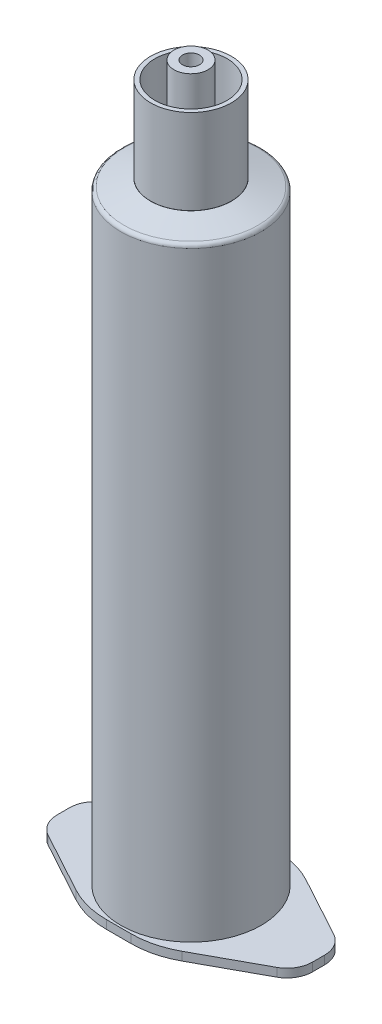
ISO-10303-21;
HEADER;
FILE_DESCRIPTION(('STEP AP214'),'2;1');
FILE_NAME('part.step','',(''),(''),'','','');
FILE_SCHEMA(('AUTOMOTIVE_DESIGN { 1 0 10303 214 1 1 1 1 }'));
ENDSEC;
DATA;
#1=APPLICATION_CONTEXT('core data for automotive mechanical design processes');
#2=APPLICATION_PROTOCOL_DEFINITION('international standard','automotive_design',2000,#1);
#3=PRODUCT_CONTEXT('',#1,'mechanical');
#4=PRODUCT('Part','Part','',(#3));
#5=PRODUCT_RELATED_PRODUCT_CATEGORY('part','',(#4));
#6=PRODUCT_DEFINITION_FORMATION('','',#4);
#7=PRODUCT_DEFINITION_CONTEXT('part definition',#1,'design');
#8=PRODUCT_DEFINITION('design','',#6,#7);
#9=PRODUCT_DEFINITION_SHAPE('','',#8);
#10=(LENGTH_UNIT() NAMED_UNIT(*) SI_UNIT(.MILLI.,.METRE.));
#11=(NAMED_UNIT(*) PLANE_ANGLE_UNIT() SI_UNIT($,.RADIAN.));
#12=(NAMED_UNIT(*) SI_UNIT($,.STERADIAN.) SOLID_ANGLE_UNIT());
#13=UNCERTAINTY_MEASURE_WITH_UNIT(LENGTH_MEASURE(1.E-05),#10,'distance_accuracy_value','');
#14=(GEOMETRIC_REPRESENTATION_CONTEXT(3) GLOBAL_UNCERTAINTY_ASSIGNED_CONTEXT((#13)) GLOBAL_UNIT_ASSIGNED_CONTEXT((#10,
#11,#12)) REPRESENTATION_CONTEXT('',''));
#15=CARTESIAN_POINT('',(0.,0.,0.));
#16=DIRECTION('',(0.,0.,1.));
#17=DIRECTION('',(1.,0.,0.));
#18=AXIS2_PLACEMENT_3D('',#15,#16,#17);
#19=CARTESIAN_POINT('',(0.,85.,0.));
#20=DIRECTION('',(0.,-1.,0.));
#21=DIRECTION('',(0.,0.,-1.));
#22=AXIS2_PLACEMENT_3D('',#19,#20,#21);
#23=CYLINDRICAL_SURFACE('',#22,8.25);
#24=CARTESIAN_POINT('',(0.,1.,0.));
#25=DIRECTION('',(0.,1.,0.));
#26=DIRECTION('',(0.,0.,1.));
#27=AXIS2_PLACEMENT_3D('',#24,#25,#26);
#28=CIRCLE('',#27,8.25);
#29=CARTESIAN_POINT('',(0.,1.,8.25));
#30=VERTEX_POINT('',#29);
#31=EDGE_CURVE('E231',#30,#30,#28,.T.);
#32=ORIENTED_EDGE('',*,*,#31,.T.);
#33=EDGE_LOOP('',(#32));
#34=FACE_BOUND('',#33,.T.);
#35=CARTESIAN_POINT('',(0.,71.6232229749486,0.));
#36=DIRECTION('',(0.,1.,0.));
#37=DIRECTION('',(0.,0.,1.));
#38=AXIS2_PLACEMENT_3D('',#35,#36,#37);
#39=CIRCLE('',#38,8.25);
#40=CARTESIAN_POINT('',(0.,71.6232229749486,8.25));
#41=VERTEX_POINT('',#40);
#42=EDGE_CURVE('E44',#41,#41,#39,.F.);
#43=ORIENTED_EDGE('',*,*,#42,.T.);
#44=EDGE_LOOP('',(#43));
#45=FACE_BOUND('',#44,.T.);
#46=ADVANCED_FACE('F35',(#34,#45),#23,.T.);
#47=CARTESIAN_POINT('',(0.,0.,0.));
#48=DIRECTION('',(0.,1.,0.));
#49=DIRECTION('',(0.,0.,1.));
#50=AXIS2_PLACEMENT_3D('',#47,#48,#49);
#51=PLANE('',#50);
#52=CARTESIAN_POINT('',(0.,0.,0.));
#53=DIRECTION('',(0.,1.,0.));
#54=DIRECTION('',(0.,0.,1.));
#55=AXIS2_PLACEMENT_3D('',#52,#53,#54);
#56=CIRCLE('',#55,7.25);
#57=CARTESIAN_POINT('',(0.,0.,7.25));
#58=VERTEX_POINT('',#57);
#59=EDGE_CURVE('E267',#58,#58,#56,.T.);
#60=ORIENTED_EDGE('',*,*,#59,.T.);
#61=EDGE_LOOP('',(#60));
#62=FACE_BOUND('',#61,.T.);
#63=CARTESIAN_POINT('',(-1.45005985643056,0.,-1.50000000000001));
#64=DIRECTION('',(0.,-1.,0.));
#65=DIRECTION('',(0.,0.,1.));
#66=AXIS2_PLACEMENT_3D('',#63,#64,#65);
#67=CIRCLE('',#66,10.);
#68=CARTESIAN_POINT('',(-1.45005985643056,0.,8.49999999999999));
#69=VERTEX_POINT('',#68);
#70=CARTESIAN_POINT('',(-6.23858116323628,0.,7.27895572914383));
#71=VERTEX_POINT('',#70);
#72=EDGE_CURVE('E184',#69,#71,#67,.T.);
#73=ORIENTED_EDGE('',*,*,#72,.T.);
#74=DIRECTION('',(-0.877895572914385,0.,-0.478852130680572));
#75=VECTOR('',#74,1.);
#76=CARTESIAN_POINT('',(-13.4365563920417,0.,3.3527874225227));
#77=LINE('',#76,#75);
#78=CARTESIAN_POINT('',(-13.4365563920417,0.,3.3527874225227));
#79=VERTEX_POINT('',#78);
#80=EDGE_CURVE('E187',#71,#79,#77,.T.);
#81=ORIENTED_EDGE('',*,*,#80,.T.);
#82=CARTESIAN_POINT('',(-12.,0.,0.719100703779545));
#83=DIRECTION('',(0.,-1.,0.));
#84=DIRECTION('',(0.,0.,-1.));
#85=AXIS2_PLACEMENT_3D('',#82,#83,#84);
#86=CIRCLE('',#85,3.);
#87=CARTESIAN_POINT('',(-15.,0.,0.719100703779545));
#88=VERTEX_POINT('',#87);
#89=EDGE_CURVE('E190',#79,#88,#86,.T.);
#90=ORIENTED_EDGE('',*,*,#89,.T.);
#91=DIRECTION('',(0.,0.,-1.));
#92=VECTOR('',#91,1.);
#93=CARTESIAN_POINT('',(-15.,0.,-0.719100703779545));
#94=LINE('',#93,#92);
#95=CARTESIAN_POINT('',(-15.,0.,-0.719100703779545));
#96=VERTEX_POINT('',#95);
#97=EDGE_CURVE('E193',#88,#96,#94,.T.);
#98=ORIENTED_EDGE('',*,*,#97,.T.);
#99=CARTESIAN_POINT('',(-12.,0.,-0.719100703779545));
#100=DIRECTION('',(0.,-1.,0.));
#101=DIRECTION('',(0.,0.,1.));
#102=AXIS2_PLACEMENT_3D('',#99,#100,#101);
#103=CIRCLE('',#102,3.);
#104=CARTESIAN_POINT('',(-13.4365563920417,0.,-3.3527874225227));
#105=VERTEX_POINT('',#104);
#106=EDGE_CURVE('E196',#96,#105,#103,.T.);
#107=ORIENTED_EDGE('',*,*,#106,.T.);
#108=DIRECTION('',(0.877895572914384,0.,-0.478852130680574));
#109=VECTOR('',#108,1.);
#110=CARTESIAN_POINT('',(-6.2385811632363,0.,-7.27895572914384));
#111=LINE('',#110,#109);
#112=CARTESIAN_POINT('',(-6.2385811632363,0.,-7.27895572914384));
#113=VERTEX_POINT('',#112);
#114=EDGE_CURVE('E199',#105,#113,#111,.T.);
#115=ORIENTED_EDGE('',*,*,#114,.T.);
#116=CARTESIAN_POINT('',(-1.45005985643056,0.,1.5));
#117=DIRECTION('',(0.,-1.,0.));
#118=DIRECTION('',(0.,0.,1.));
#119=AXIS2_PLACEMENT_3D('',#116,#117,#118);
#120=CIRCLE('',#119,10.);
#121=CARTESIAN_POINT('',(-1.45005985643056,0.,-8.5));
#122=VERTEX_POINT('',#121);
#123=EDGE_CURVE('E202',#113,#122,#120,.T.);
#124=ORIENTED_EDGE('',*,*,#123,.T.);
#125=DIRECTION('',(1.,0.,0.));
#126=VECTOR('',#125,1.);
#127=CARTESIAN_POINT('',(1.45005985643056,0.,-8.5));
#128=LINE('',#127,#126);
#129=CARTESIAN_POINT('',(1.45005985643056,0.,-8.5));
#130=VERTEX_POINT('',#129);
#131=EDGE_CURVE('E205',#122,#130,#128,.T.);
#132=ORIENTED_EDGE('',*,*,#131,.T.);
#133=CARTESIAN_POINT('',(1.45005985643056,0.,1.5));
#134=DIRECTION('',(0.,-1.,0.));
#135=DIRECTION('',(0.,0.,1.));
#136=AXIS2_PLACEMENT_3D('',#133,#134,#135);
#137=CIRCLE('',#136,10.);
#138=CARTESIAN_POINT('',(6.2385811632363,0.,-7.27895572914384));
#139=VERTEX_POINT('',#138);
#140=EDGE_CURVE('E208',#130,#139,#137,.T.);
#141=ORIENTED_EDGE('',*,*,#140,.T.);
#142=DIRECTION('',(0.877895572914384,0.,0.478852130680574));
#143=VECTOR('',#142,1.);
#144=CARTESIAN_POINT('',(13.4365563920417,0.,-3.3527874225227));
#145=LINE('',#144,#143);
#146=CARTESIAN_POINT('',(13.4365563920417,0.,-3.3527874225227));
#147=VERTEX_POINT('',#146);
#148=EDGE_CURVE('E211',#139,#147,#145,.T.);
#149=ORIENTED_EDGE('',*,*,#148,.T.);
#150=CARTESIAN_POINT('',(12.,0.,-0.719100703779545));
#151=DIRECTION('',(0.,-1.,0.));
#152=DIRECTION('',(0.,0.,1.));
#153=AXIS2_PLACEMENT_3D('',#150,#151,#152);
#154=CIRCLE('',#153,3.);
#155=CARTESIAN_POINT('',(15.,0.,-0.719100703779545));
#156=VERTEX_POINT('',#155);
#157=EDGE_CURVE('E214',#147,#156,#154,.T.);
#158=ORIENTED_EDGE('',*,*,#157,.T.);
#159=DIRECTION('',(0.,0.,1.));
#160=VECTOR('',#159,1.);
#161=CARTESIAN_POINT('',(15.,0.,0.719100703779545));
#162=LINE('',#161,#160);
#163=CARTESIAN_POINT('',(15.,0.,0.719100703779545));
#164=VERTEX_POINT('',#163);
#165=EDGE_CURVE('E217',#156,#164,#162,.T.);
#166=ORIENTED_EDGE('',*,*,#165,.T.);
#167=CARTESIAN_POINT('',(12.,0.,0.719100703779545));
#168=DIRECTION('',(0.,-1.,0.));
#169=DIRECTION('',(0.,0.,1.));
#170=AXIS2_PLACEMENT_3D('',#167,#168,#169);
#171=CIRCLE('',#170,3.);
#172=CARTESIAN_POINT('',(13.4365563920417,0.,3.3527874225227));
#173=VERTEX_POINT('',#172);
#174=EDGE_CURVE('E220',#164,#173,#171,.T.);
#175=ORIENTED_EDGE('',*,*,#174,.T.);
#176=DIRECTION('',(-0.877895572914385,0.,0.478852130680572));
#177=VECTOR('',#176,1.);
#178=CARTESIAN_POINT('',(6.23858116323628,0.,7.27895572914383));
#179=LINE('',#178,#177);
#180=CARTESIAN_POINT('',(6.23858116323628,0.,7.27895572914383));
#181=VERTEX_POINT('',#180);
#182=EDGE_CURVE('E223',#173,#181,#179,.T.);
#183=ORIENTED_EDGE('',*,*,#182,.T.);
#184=CARTESIAN_POINT('',(1.45005985643056,0.,-1.50000000000001));
#185=DIRECTION('',(0.,-1.,0.));
#186=DIRECTION('',(0.,0.,1.));
#187=AXIS2_PLACEMENT_3D('',#184,#185,#186);
#188=CIRCLE('',#187,10.);
#189=CARTESIAN_POINT('',(1.45005985643056,0.,8.49999999999999));
#190=VERTEX_POINT('',#189);
#191=EDGE_CURVE('E160',#181,#190,#188,.T.);
#192=ORIENTED_EDGE('',*,*,#191,.T.);
#193=DIRECTION('',(-1.,0.,0.));
#194=VECTOR('',#193,1.);
#195=CARTESIAN_POINT('',(-1.45005985643056,0.,8.49999999999999));
#196=LINE('',#195,#194);
#197=EDGE_CURVE('E226',#190,#69,#196,.T.);
#198=ORIENTED_EDGE('',*,*,#197,.T.);
#199=EDGE_LOOP('',(#73,#81,#90,#98,#107,#115,#124,#132,#141,#149,#158,#166,#175,#183,#192,#198));
#200=FACE_BOUND('',#199,.T.);
#201=ADVANCED_FACE('F313',(#62,#200),#51,.F.);
#202=CARTESIAN_POINT('',(0.,73.,0.));
#203=DIRECTION('',(0.,1.,0.));
#204=DIRECTION('',(0.,0.,1.));
#205=AXIS2_PLACEMENT_3D('',#202,#203,#204);
#206=PLANE('',#205);
#207=CARTESIAN_POINT('',(0.,73.,0.));
#208=DIRECTION('',(0.,1.,0.));
#209=DIRECTION('',(0.,0.,1.));
#210=AXIS2_PLACEMENT_3D('',#207,#208,#209);
#211=CIRCLE('',#210,4.76258555615912);
#212=CARTESIAN_POINT('',(0.,73.,4.76258555615912));
#213=VERTEX_POINT('',#212);
#214=EDGE_CURVE('E292',#213,#213,#211,.T.);
#215=ORIENTED_EDGE('',*,*,#214,.T.);
#216=EDGE_LOOP('',(#215));
#217=FACE_BOUND('',#216,.T.);
#218=CARTESIAN_POINT('',(0.,73.,0.));
#219=DIRECTION('',(0.,1.,0.));
#220=DIRECTION('',(0.,0.,1.));
#221=AXIS2_PLACEMENT_3D('',#218,#219,#220);
#222=CIRCLE('',#221,4.75);
#223=CARTESIAN_POINT('',(0.,73.,-4.75));
#224=VERTEX_POINT('',#223);
#225=EDGE_CURVE('E279',#224,#224,#222,.T.);
#226=ORIENTED_EDGE('',*,*,#225,.F.);
#227=EDGE_LOOP('',(#226));
#228=FACE_BOUND('',#227,.T.);
#229=ADVANCED_FACE('F319',(#217,#228),#206,.T.);
#230=CARTESIAN_POINT('',(0.,98.4350288425444,0.));
#231=DIRECTION('',(0.,-1.,0.));
#232=DIRECTION('',(0.,0.,-1.));
#233=AXIS2_PLACEMENT_3D('',#230,#231,#232);
#234=CYLINDRICAL_SURFACE('',#233,4.75);
#235=CARTESIAN_POINT('',(0.,83.,0.));
#236=DIRECTION('',(0.,1.,0.));
#237=DIRECTION('',(0.,0.,1.));
#238=AXIS2_PLACEMENT_3D('',#235,#236,#237);
#239=CIRCLE('',#238,4.75);
#240=CARTESIAN_POINT('',(0.,83.,-4.75));
#241=VERTEX_POINT('',#240);
#242=EDGE_CURVE('E275',#241,#241,#239,.T.);
#243=CARTESIAN_POINT('',(0.,73.,-4.75));
#244=CARTESIAN_POINT('',(0.,73.1041666666667,-4.75));
#245=CARTESIAN_POINT('',(0.,73.2083333333333,-4.75));
#246=CARTESIAN_POINT('',(0.,73.4166666666667,-4.75));
#247=CARTESIAN_POINT('',(0.,73.5208333333333,-4.75));
#248=CARTESIAN_POINT('',(0.,73.7291666666667,-4.75));
#249=CARTESIAN_POINT('',(0.,73.8333333333333,-4.75));
#250=CARTESIAN_POINT('',(0.,74.0416666666667,-4.75));
#251=CARTESIAN_POINT('',(0.,74.1458333333333,-4.75));
#252=CARTESIAN_POINT('',(0.,74.3541666666667,-4.75));
#253=CARTESIAN_POINT('',(0.,74.4583333333333,-4.75));
#254=CARTESIAN_POINT('',(0.,74.6666666666667,-4.75));
#255=CARTESIAN_POINT('',(0.,74.7708333333333,-4.75));
#256=CARTESIAN_POINT('',(0.,74.9791666666667,-4.75));
#257=CARTESIAN_POINT('',(0.,75.0833333333333,-4.75));
#258=CARTESIAN_POINT('',(0.,75.2916666666667,-4.75));
#259=CARTESIAN_POINT('',(0.,75.3958333333333,-4.75));
#260=CARTESIAN_POINT('',(0.,75.6041666666667,-4.75));
#261=CARTESIAN_POINT('',(0.,75.7083333333333,-4.75));
#262=CARTESIAN_POINT('',(0.,75.9166666666667,-4.75));
#263=CARTESIAN_POINT('',(0.,76.0208333333333,-4.75));
#264=CARTESIAN_POINT('',(0.,76.2291666666667,-4.75));
#265=CARTESIAN_POINT('',(0.,76.3333333333333,-4.75));
#266=CARTESIAN_POINT('',(0.,76.5416666666667,-4.75));
#267=CARTESIAN_POINT('',(0.,76.6458333333333,-4.75));
#268=CARTESIAN_POINT('',(0.,76.8541666666667,-4.75));
#269=CARTESIAN_POINT('',(0.,76.9583333333333,-4.75));
#270=CARTESIAN_POINT('',(0.,77.1666666666667,-4.75));
#271=CARTESIAN_POINT('',(0.,77.2708333333333,-4.75));
#272=CARTESIAN_POINT('',(0.,77.4791666666667,-4.75));
#273=CARTESIAN_POINT('',(0.,77.5833333333333,-4.75));
#274=CARTESIAN_POINT('',(0.,77.7916666666667,-4.75));
#275=CARTESIAN_POINT('',(0.,77.8958333333333,-4.75));
#276=CARTESIAN_POINT('',(0.,78.1041666666667,-4.75));
#277=CARTESIAN_POINT('',(0.,78.2083333333333,-4.75));
#278=CARTESIAN_POINT('',(0.,78.4166666666667,-4.75));
#279=CARTESIAN_POINT('',(0.,78.5208333333333,-4.75));
#280=CARTESIAN_POINT('',(0.,78.7291666666667,-4.75));
#281=CARTESIAN_POINT('',(0.,78.8333333333333,-4.75));
#282=CARTESIAN_POINT('',(0.,79.0416666666667,-4.75));
#283=CARTESIAN_POINT('',(0.,79.1458333333333,-4.75));
#284=CARTESIAN_POINT('',(0.,79.3541666666667,-4.75));
#285=CARTESIAN_POINT('',(0.,79.4583333333333,-4.75));
#286=CARTESIAN_POINT('',(0.,79.6666666666667,-4.75));
#287=CARTESIAN_POINT('',(0.,79.7708333333333,-4.75));
#288=CARTESIAN_POINT('',(0.,79.9791666666667,-4.75));
#289=CARTESIAN_POINT('',(0.,80.0833333333333,-4.75));
#290=CARTESIAN_POINT('',(0.,80.2916666666667,-4.75));
#291=CARTESIAN_POINT('',(0.,80.3958333333333,-4.75));
#292=CARTESIAN_POINT('',(0.,80.6041666666667,-4.75));
#293=CARTESIAN_POINT('',(0.,80.7083333333333,-4.75));
#294=CARTESIAN_POINT('',(0.,80.9166666666667,-4.75));
#295=CARTESIAN_POINT('',(0.,81.0208333333333,-4.75));
#296=CARTESIAN_POINT('',(0.,81.2291666666667,-4.75));
#297=CARTESIAN_POINT('',(0.,81.3333333333333,-4.75));
#298=CARTESIAN_POINT('',(0.,81.5416666666667,-4.75));
#299=CARTESIAN_POINT('',(0.,81.6458333333333,-4.75));
#300=CARTESIAN_POINT('',(0.,81.8541666666667,-4.75));
#301=CARTESIAN_POINT('',(0.,81.9583333333333,-4.75));
#302=CARTESIAN_POINT('',(0.,82.1666666666667,-4.75));
#303=CARTESIAN_POINT('',(0.,82.2708333333333,-4.75));
#304=CARTESIAN_POINT('',(0.,82.4791666666667,-4.75));
#305=CARTESIAN_POINT('',(0.,82.5833333333333,-4.75));
#306=CARTESIAN_POINT('',(0.,82.7916666666667,-4.75));
#307=CARTESIAN_POINT('',(0.,82.8958333333333,-4.75));
#308=CARTESIAN_POINT('',(0.,83.,-4.75));
#309=B_SPLINE_CURVE_WITH_KNOTS('',3,(#243,#244,#245,#246,#247,#248,#249,#250,#251,#252,#253,
#254,#255,#256,#257,#258,#259,#260,#261,#262,#263,#264,#265,#266,#267,#268,#269,#270,#271,#272,
#273,#274,#275,#276,#277,#278,#279,#280,#281,#282,#283,#284,#285,#286,#287,#288,#289,#290,#291,
#292,#293,#294,#295,#296,#297,#298,#299,#300,#301,#302,#303,#304,#305,#306,#307,#308),
.UNSPECIFIED.,.F.,.F.,(4,2,2,2,2,2,2,2,2,2,2,2,2,2,2,2,2,2,2,2,2,2,2,2,2,2,2,2,2,2,2,2,4),(0.,
0.312500000000007,0.625000000000001,0.937500000000008,1.25,1.56250000000001,1.875,
2.18750000000001,2.5,2.81250000000001,3.125,3.4375,3.75,4.06250000000001,4.375,4.6875,5.,
5.31250000000001,5.62500000000001,5.9375,6.25000000000001,6.56250000000001,6.87500000000001,
7.1875,7.50000000000001,7.8125,8.12500000000001,8.4375,8.75000000000001,9.0625,9.37500000000001,
9.6875,10.),.UNSPECIFIED.);
#310=EDGE_CURVE('BSEAM331',#224,#241,#309,.T.);
#311=ORIENTED_EDGE('',*,*,#225,.T.);
#312=ORIENTED_EDGE('',*,*,#242,.F.);
#313=ORIENTED_EDGE('',*,*,#310,.T.);
#314=ORIENTED_EDGE('',*,*,#310,.F.);
#315=EDGE_LOOP('',(#311,#313,#312,#314));
#316=FACE_BOUND('',#315,.T.);
#317=ADVANCED_FACE('F331',(#316),#234,.T.);
#318=CARTESIAN_POINT('',(0.,98.4350288425444,0.));
#319=DIRECTION('',(0.,-1.,0.));
#320=DIRECTION('',(0.,0.,-1.));
#321=AXIS2_PLACEMENT_3D('',#318,#319,#320);
#322=CYLINDRICAL_SURFACE('',#321,4.25);
#323=CARTESIAN_POINT('',(0.,73.,0.));
#324=DIRECTION('',(0.,1.,0.));
#325=DIRECTION('',(0.,0.,1.));
#326=AXIS2_PLACEMENT_3D('',#323,#324,#325);
#327=CIRCLE('',#326,4.25);
#328=CARTESIAN_POINT('',(0.,73.,-4.25));
#329=VERTEX_POINT('',#328);
#330=EDGE_CURVE('E287',#329,#329,#327,.F.);
#331=CARTESIAN_POINT('',(0.,83.,0.));
#332=DIRECTION('',(0.,1.,0.));
#333=DIRECTION('',(0.,0.,1.));
#334=AXIS2_PLACEMENT_3D('',#331,#332,#333);
#335=CIRCLE('',#334,4.25);
#336=CARTESIAN_POINT('',(0.,83.,-4.25));
#337=VERTEX_POINT('',#336);
#338=EDGE_CURVE('E263',#337,#337,#335,.T.);
#339=CARTESIAN_POINT('',(0.,73.,-4.25));
#340=CARTESIAN_POINT('',(0.,73.1041666666667,-4.25));
#341=CARTESIAN_POINT('',(0.,73.2083333333333,-4.25));
#342=CARTESIAN_POINT('',(0.,73.4166666666667,-4.25));
#343=CARTESIAN_POINT('',(0.,73.5208333333333,-4.25));
#344=CARTESIAN_POINT('',(0.,73.7291666666667,-4.25));
#345=CARTESIAN_POINT('',(0.,73.8333333333333,-4.25));
#346=CARTESIAN_POINT('',(0.,74.0416666666667,-4.25));
#347=CARTESIAN_POINT('',(0.,74.1458333333333,-4.25));
#348=CARTESIAN_POINT('',(0.,74.3541666666667,-4.25));
#349=CARTESIAN_POINT('',(0.,74.4583333333333,-4.25));
#350=CARTESIAN_POINT('',(0.,74.6666666666667,-4.25));
#351=CARTESIAN_POINT('',(0.,74.7708333333333,-4.25));
#352=CARTESIAN_POINT('',(0.,74.9791666666667,-4.25));
#353=CARTESIAN_POINT('',(0.,75.0833333333333,-4.25));
#354=CARTESIAN_POINT('',(0.,75.2916666666667,-4.25));
#355=CARTESIAN_POINT('',(0.,75.3958333333333,-4.25));
#356=CARTESIAN_POINT('',(0.,75.6041666666667,-4.25));
#357=CARTESIAN_POINT('',(0.,75.7083333333333,-4.25));
#358=CARTESIAN_POINT('',(0.,75.9166666666667,-4.25));
#359=CARTESIAN_POINT('',(0.,76.0208333333333,-4.25));
#360=CARTESIAN_POINT('',(0.,76.2291666666667,-4.25));
#361=CARTESIAN_POINT('',(0.,76.3333333333333,-4.25));
#362=CARTESIAN_POINT('',(0.,76.5416666666667,-4.25));
#363=CARTESIAN_POINT('',(0.,76.6458333333333,-4.25));
#364=CARTESIAN_POINT('',(0.,76.8541666666667,-4.25));
#365=CARTESIAN_POINT('',(0.,76.9583333333333,-4.25));
#366=CARTESIAN_POINT('',(0.,77.1666666666667,-4.25));
#367=CARTESIAN_POINT('',(0.,77.2708333333333,-4.25));
#368=CARTESIAN_POINT('',(0.,77.4791666666667,-4.25));
#369=CARTESIAN_POINT('',(0.,77.5833333333333,-4.25));
#370=CARTESIAN_POINT('',(0.,77.7916666666667,-4.25));
#371=CARTESIAN_POINT('',(0.,77.8958333333333,-4.25));
#372=CARTESIAN_POINT('',(0.,78.1041666666667,-4.25));
#373=CARTESIAN_POINT('',(0.,78.2083333333333,-4.25));
#374=CARTESIAN_POINT('',(0.,78.4166666666667,-4.25));
#375=CARTESIAN_POINT('',(0.,78.5208333333333,-4.25));
#376=CARTESIAN_POINT('',(0.,78.7291666666667,-4.25));
#377=CARTESIAN_POINT('',(0.,78.8333333333333,-4.25));
#378=CARTESIAN_POINT('',(0.,79.0416666666667,-4.25));
#379=CARTESIAN_POINT('',(0.,79.1458333333333,-4.25));
#380=CARTESIAN_POINT('',(0.,79.3541666666667,-4.25));
#381=CARTESIAN_POINT('',(0.,79.4583333333333,-4.25));
#382=CARTESIAN_POINT('',(0.,79.6666666666667,-4.25));
#383=CARTESIAN_POINT('',(0.,79.7708333333333,-4.25));
#384=CARTESIAN_POINT('',(0.,79.9791666666667,-4.25));
#385=CARTESIAN_POINT('',(0.,80.0833333333333,-4.25));
#386=CARTESIAN_POINT('',(0.,80.2916666666667,-4.25));
#387=CARTESIAN_POINT('',(0.,80.3958333333333,-4.25));
#388=CARTESIAN_POINT('',(0.,80.6041666666667,-4.25));
#389=CARTESIAN_POINT('',(0.,80.7083333333333,-4.25));
#390=CARTESIAN_POINT('',(0.,80.9166666666667,-4.25));
#391=CARTESIAN_POINT('',(0.,81.0208333333333,-4.25));
#392=CARTESIAN_POINT('',(0.,81.2291666666667,-4.25));
#393=CARTESIAN_POINT('',(0.,81.3333333333333,-4.25));
#394=CARTESIAN_POINT('',(0.,81.5416666666667,-4.25));
#395=CARTESIAN_POINT('',(0.,81.6458333333333,-4.25));
#396=CARTESIAN_POINT('',(0.,81.8541666666667,-4.25));
#397=CARTESIAN_POINT('',(0.,81.9583333333333,-4.25));
#398=CARTESIAN_POINT('',(0.,82.1666666666667,-4.25));
#399=CARTESIAN_POINT('',(0.,82.2708333333333,-4.25));
#400=CARTESIAN_POINT('',(0.,82.4791666666667,-4.25));
#401=CARTESIAN_POINT('',(0.,82.5833333333333,-4.25));
#402=CARTESIAN_POINT('',(0.,82.7916666666667,-4.25));
#403=CARTESIAN_POINT('',(0.,82.8958333333333,-4.25));
#404=CARTESIAN_POINT('',(0.,83.,-4.25));
#405=B_SPLINE_CURVE_WITH_KNOTS('',3,(#339,#340,#341,#342,#343,#344,#345,#346,#347,#348,#349,
#350,#351,#352,#353,#354,#355,#356,#357,#358,#359,#360,#361,#362,#363,#364,#365,#366,#367,#368,
#369,#370,#371,#372,#373,#374,#375,#376,#377,#378,#379,#380,#381,#382,#383,#384,#385,#386,#387,
#388,#389,#390,#391,#392,#393,#394,#395,#396,#397,#398,#399,#400,#401,#402,#403,#404),
.UNSPECIFIED.,.F.,.F.,(4,2,2,2,2,2,2,2,2,2,2,2,2,2,2,2,2,2,2,2,2,2,2,2,2,2,2,2,2,2,2,2,4),(0.,
0.312500000000007,0.625000000000001,0.937500000000008,1.25,1.56250000000001,1.875,
2.18750000000001,2.5,2.81250000000001,3.125,3.4375,3.75,4.06250000000001,4.375,4.6875,5.,
5.31250000000001,5.62500000000001,5.9375,6.25000000000001,6.56250000000001,6.87500000000001,
7.1875,7.50000000000001,7.8125,8.12500000000001,8.4375,8.75000000000001,9.0625,9.37500000000001,
9.6875,10.),.UNSPECIFIED.);
#406=EDGE_CURVE('BSEAM338',#329,#337,#405,.T.);
#407=ORIENTED_EDGE('',*,*,#330,.T.);
#408=ORIENTED_EDGE('',*,*,#338,.T.);
#409=ORIENTED_EDGE('',*,*,#406,.T.);
#410=ORIENTED_EDGE('',*,*,#406,.F.);
#411=EDGE_LOOP('',(#407,#409,#408,#410));
#412=FACE_BOUND('',#411,.T.);
#413=ADVANCED_FACE('F338',(#412),#322,.F.);
#414=CARTESIAN_POINT('',(0.,83.,0.));
#415=DIRECTION('',(0.,1.,0.));
#416=DIRECTION('',(0.,0.,1.));
#417=AXIS2_PLACEMENT_3D('',#414,#415,#416);
#418=PLANE('',#417);
#419=ORIENTED_EDGE('',*,*,#338,.F.);
#420=EDGE_LOOP('',(#419));
#421=FACE_BOUND('',#420,.T.);
#422=ORIENTED_EDGE('',*,*,#242,.T.);
#423=EDGE_LOOP('',(#422));
#424=FACE_BOUND('',#423,.T.);
#425=ADVANCED_FACE('F327',(#421,#424),#418,.T.);
#426=CARTESIAN_POINT('',(0.,85.,0.));
#427=DIRECTION('',(0.,1.,0.));
#428=DIRECTION('',(0.,0.,1.));
#429=AXIS2_PLACEMENT_3D('',#426,#427,#428);
#430=PLANE('',#429);
#431=CARTESIAN_POINT('',(0.,85.,0.));
#432=DIRECTION('',(0.,1.,0.));
#433=DIRECTION('',(0.,0.,1.));
#434=AXIS2_PLACEMENT_3D('',#431,#432,#433);
#435=CIRCLE('',#434,1.);
#436=CARTESIAN_POINT('',(0.,85.,1.));
#437=VERTEX_POINT('',#436);
#438=EDGE_CURVE('E259',#437,#437,#435,.T.);
#439=ORIENTED_EDGE('',*,*,#438,.F.);
#440=EDGE_LOOP('',(#439));
#441=FACE_BOUND('',#440,.T.);
#442=CARTESIAN_POINT('',(0.,85.,0.));
#443=DIRECTION('',(0.,1.,0.));
#444=DIRECTION('',(0.,0.,1.));
#445=AXIS2_PLACEMENT_3D('',#442,#443,#444);
#446=CIRCLE('',#445,2.);
#447=CARTESIAN_POINT('',(0.,85.,2.));
#448=VERTEX_POINT('',#447);
#449=EDGE_CURVE('E278',#448,#448,#446,.T.);
#450=ORIENTED_EDGE('',*,*,#449,.T.);
#451=EDGE_LOOP('',(#450));
#452=FACE_BOUND('',#451,.T.);
#453=ADVANCED_FACE('F323',(#441,#452),#430,.T.);
#454=CARTESIAN_POINT('',(0.,73.,0.));
#455=DIRECTION('',(0.,1.,0.));
#456=DIRECTION('',(0.,0.,1.));
#457=AXIS2_PLACEMENT_3D('',#454,#455,#456);
#458=CYLINDRICAL_SURFACE('',#457,2.);
#459=CARTESIAN_POINT('',(0.,73.,0.));
#460=DIRECTION('',(0.,1.,0.));
#461=DIRECTION('',(0.,0.,1.));
#462=AXIS2_PLACEMENT_3D('',#459,#460,#461);
#463=CIRCLE('',#462,2.);
#464=CARTESIAN_POINT('',(0.,73.,2.));
#465=VERTEX_POINT('',#464);
#466=EDGE_CURVE('E284',#465,#465,#463,.T.);
#467=ORIENTED_EDGE('',*,*,#466,.T.);
#468=EDGE_LOOP('',(#467));
#469=FACE_BOUND('',#468,.T.);
#470=ORIENTED_EDGE('',*,*,#449,.F.);
#471=EDGE_LOOP('',(#470));
#472=FACE_BOUND('',#471,.T.);
#473=ADVANCED_FACE('F326',(#469,#472),#458,.T.);
#474=ORIENTED_EDGE('',*,*,#466,.F.);
#475=EDGE_LOOP('',(#474));
#476=FACE_BOUND('',#475,.T.);
#477=ORIENTED_EDGE('',*,*,#330,.F.);
#478=EDGE_LOOP('',(#477));
#479=FACE_BOUND('',#478,.T.);
#480=ADVANCED_FACE('F309',(#476,#479),#206,.T.);
#481=CARTESIAN_POINT('',(0.,73.,0.));
#482=DIRECTION('',(0.,-1.,0.));
#483=DIRECTION('',(0.,0.,-1.));
#484=AXIS2_PLACEMENT_3D('',#481,#482,#483);
#485=CONICAL_SURFACE('',#484,4.76258555615912,1.2915436464758);
#486=CARTESIAN_POINT('',(0.,72.1038538229178,0.));
#487=DIRECTION('',(0.,-1.,0.));
#488=DIRECTION('',(0.,0.,-1.));
#489=AXIS2_PLACEMENT_3D('',#486,#487,#488);
#490=CIRCLE('',#489,7.8878186779085);
#491=CARTESIAN_POINT('',(0.,72.1038538229178,-7.8878186779085));
#492=VERTEX_POINT('',#491);
#493=EDGE_CURVE('E13',#492,#492,#490,.F.);
#494=ORIENTED_EDGE('',*,*,#493,.T.);
#495=EDGE_LOOP('',(#494));
#496=FACE_BOUND('',#495,.T.);
#497=ORIENTED_EDGE('',*,*,#214,.F.);
#498=EDGE_LOOP('',(#497));
#499=FACE_BOUND('',#498,.T.);
#500=ADVANCED_FACE('F300',(#496,#499),#485,.T.);
#501=CARTESIAN_POINT('',(0.,71.6232229749486,0.));
#502=DIRECTION('',(0.,1.,0.));
#503=DIRECTION('',(0.,0.,1.));
#504=AXIS2_PLACEMENT_3D('',#501,#502,#503);
#505=TOROIDAL_SURFACE('',#504,7.75,0.5);
#506=ORIENTED_EDGE('',*,*,#493,.F.);
#507=EDGE_LOOP('',(#506));
#508=FACE_BOUND('',#507,.T.);
#509=ORIENTED_EDGE('',*,*,#42,.F.);
#510=EDGE_LOOP('',(#509));
#511=FACE_BOUND('',#510,.T.);
#512=ADVANCED_FACE('F37',(#508,#511),#505,.T.);
#513=CARTESIAN_POINT('',(0.,85.,0.));
#514=DIRECTION('',(0.,-1.,0.));
#515=DIRECTION('',(0.,0.,-1.));
#516=AXIS2_PLACEMENT_3D('',#513,#514,#515);
#517=CYLINDRICAL_SURFACE('',#516,7.25);
#518=CARTESIAN_POINT('',(0.,71.2464459498972,0.));
#519=DIRECTION('',(0.,-1.,0.));
#520=DIRECTION('',(0.,0.,-1.));
#521=AXIS2_PLACEMENT_3D('',#518,#519,#520);
#522=CIRCLE('',#521,7.25);
#523=CARTESIAN_POINT('',(0.,71.2464459498972,-7.25));
#524=VERTEX_POINT('',#523);
#525=EDGE_CURVE('E260',#524,#524,#522,.T.);
#526=ORIENTED_EDGE('',*,*,#525,.F.);
#527=EDGE_LOOP('',(#526));
#528=FACE_BOUND('',#527,.T.);
#529=ORIENTED_EDGE('',*,*,#59,.F.);
#530=EDGE_LOOP('',(#529));
#531=FACE_BOUND('',#530,.T.);
#532=ADVANCED_FACE('F299',(#528,#531),#517,.F.);
#533=CARTESIAN_POINT('',(0.,72.,0.));
#534=DIRECTION('',(0.,1.,0.));
#535=DIRECTION('',(0.,0.,1.));
#536=AXIS2_PLACEMENT_3D('',#533,#534,#535);
#537=PLANE('',#536);
#538=CARTESIAN_POINT('',(0.,72.,0.));
#539=DIRECTION('',(0.,1.,0.));
#540=DIRECTION('',(0.,0.,1.));
#541=AXIS2_PLACEMENT_3D('',#538,#539,#540);
#542=CIRCLE('',#541,4.62204472145675);
#543=CARTESIAN_POINT('',(0.,72.,4.62204472145675));
#544=VERTEX_POINT('',#543);
#545=EDGE_CURVE('E264',#544,#544,#542,.T.);
#546=ORIENTED_EDGE('',*,*,#545,.F.);
#547=EDGE_LOOP('',(#546));
#548=FACE_BOUND('',#547,.T.);
#549=CARTESIAN_POINT('',(0.,72.,0.));
#550=DIRECTION('',(0.,1.,0.));
#551=DIRECTION('',(0.,0.,1.));
#552=AXIS2_PLACEMENT_3D('',#549,#550,#551);
#553=CIRCLE('',#552,1.);
#554=CARTESIAN_POINT('',(0.,72.,1.));
#555=VERTEX_POINT('',#554);
#556=EDGE_CURVE('E268',#555,#555,#553,.T.);
#557=ORIENTED_EDGE('',*,*,#556,.T.);
#558=EDGE_LOOP('',(#557));
#559=FACE_BOUND('',#558,.T.);
#560=ADVANCED_FACE('F306',(#548,#559),#537,.F.);
#561=CARTESIAN_POINT('',(0.,73.,0.));
#562=DIRECTION('',(0.,1.,0.));
#563=DIRECTION('',(0.,0.,1.));
#564=AXIS2_PLACEMENT_3D('',#561,#562,#563);
#565=CYLINDRICAL_SURFACE('',#564,1.);
#566=ORIENTED_EDGE('',*,*,#556,.F.);
#567=EDGE_LOOP('',(#566));
#568=FACE_BOUND('',#567,.T.);
#569=ORIENTED_EDGE('',*,*,#438,.T.);
#570=EDGE_LOOP('',(#569));
#571=FACE_BOUND('',#570,.T.);
#572=ADVANCED_FACE('F349',(#568,#571),#565,.F.);
#573=CARTESIAN_POINT('',(0.,72.0387383040617,0.));
#574=DIRECTION('',(0.,-1.,0.));
#575=DIRECTION('',(0.,0.,-1.));
#576=AXIS2_PLACEMENT_3D('',#573,#574,#575);
#577=CONICAL_SURFACE('',#576,4.48694820034212,1.2915436464758);
#578=ORIENTED_EDGE('',*,*,#525,.T.);
#579=EDGE_LOOP('',(#578));
#580=FACE_BOUND('',#579,.T.);
#581=ORIENTED_EDGE('',*,*,#545,.T.);
#582=EDGE_LOOP('',(#581));
#583=FACE_BOUND('',#582,.T.);
#584=ADVANCED_FACE('F346',(#580,#583),#577,.F.);
#585=CARTESIAN_POINT('',(-1.45005985643056,1.,-1.50000000000001));
#586=DIRECTION('',(0.,1.,0.));
#587=DIRECTION('',(0.,0.,1.));
#588=AXIS2_PLACEMENT_3D('',#585,#586,#587);
#589=PLANE('',#588);
#590=CARTESIAN_POINT('',(-1.45005985643056,1.,-1.50000000000001));
#591=DIRECTION('',(0.,-1.,0.));
#592=DIRECTION('',(0.,0.,1.));
#593=AXIS2_PLACEMENT_3D('',#590,#591,#592);
#594=CIRCLE('',#593,10.);
#595=CARTESIAN_POINT('',(-1.45005985643056,1.,8.49999999999999));
#596=VERTEX_POINT('',#595);
#597=CARTESIAN_POINT('',(-6.23858116323628,1.,7.27895572914383));
#598=VERTEX_POINT('',#597);
#599=EDGE_CURVE('E229',#596,#598,#594,.T.);
#600=ORIENTED_EDGE('',*,*,#599,.F.);
#601=DIRECTION('',(-1.,0.,0.));
#602=VECTOR('',#601,1.);
#603=CARTESIAN_POINT('',(-1.45005985643056,1.,8.49999999999999));
#604=LINE('',#603,#602);
#605=CARTESIAN_POINT('',(1.45005985643056,1.,8.49999999999999));
#606=VERTEX_POINT('',#605);
#607=EDGE_CURVE('E174',#606,#596,#604,.T.);
#608=ORIENTED_EDGE('',*,*,#607,.F.);
#609=CARTESIAN_POINT('',(1.45005985643056,1.,-1.50000000000001));
#610=DIRECTION('',(0.,-1.,0.));
#611=DIRECTION('',(0.,0.,1.));
#612=AXIS2_PLACEMENT_3D('',#609,#610,#611);
#613=CIRCLE('',#612,10.);
#614=CARTESIAN_POINT('',(6.23858116323628,1.,7.27895572914383));
#615=VERTEX_POINT('',#614);
#616=EDGE_CURVE('E158',#615,#606,#613,.T.);
#617=ORIENTED_EDGE('',*,*,#616,.F.);
#618=DIRECTION('',(-0.877895572914385,0.,0.478852130680572));
#619=VECTOR('',#618,1.);
#620=CARTESIAN_POINT('',(6.23858116323628,1.,7.27895572914383));
#621=LINE('',#620,#619);
#622=CARTESIAN_POINT('',(13.4365563920417,1.,3.3527874225227));
#623=VERTEX_POINT('',#622);
#624=EDGE_CURVE('E172',#623,#615,#621,.T.);
#625=ORIENTED_EDGE('',*,*,#624,.F.);
#626=CARTESIAN_POINT('',(12.,1.,0.719100703779545));
#627=DIRECTION('',(0.,-1.,0.));
#628=DIRECTION('',(0.,0.,1.));
#629=AXIS2_PLACEMENT_3D('',#626,#627,#628);
#630=CIRCLE('',#629,3.);
#631=CARTESIAN_POINT('',(15.,1.,0.719100703779545));
#632=VERTEX_POINT('',#631);
#633=EDGE_CURVE('E177',#632,#623,#630,.T.);
#634=ORIENTED_EDGE('',*,*,#633,.F.);
#635=DIRECTION('',(0.,0.,1.));
#636=VECTOR('',#635,1.);
#637=CARTESIAN_POINT('',(15.,1.,0.719100703779545));
#638=LINE('',#637,#636);
#639=CARTESIAN_POINT('',(15.,1.,-0.719100703779545));
#640=VERTEX_POINT('',#639);
#641=EDGE_CURVE('E179',#640,#632,#638,.T.);
#642=ORIENTED_EDGE('',*,*,#641,.F.);
#643=CARTESIAN_POINT('',(12.,1.,-0.719100703779545));
#644=DIRECTION('',(0.,-1.,0.));
#645=DIRECTION('',(0.,0.,1.));
#646=AXIS2_PLACEMENT_3D('',#643,#644,#645);
#647=CIRCLE('',#646,3.);
#648=CARTESIAN_POINT('',(13.4365563920417,1.,-3.3527874225227));
#649=VERTEX_POINT('',#648);
#650=EDGE_CURVE('E626',#649,#640,#647,.T.);
#651=ORIENTED_EDGE('',*,*,#650,.F.);
#652=DIRECTION('',(0.877895572914384,0.,0.478852130680574));
#653=VECTOR('',#652,1.);
#654=CARTESIAN_POINT('',(13.4365563920417,1.,-3.3527874225227));
#655=LINE('',#654,#653);
#656=CARTESIAN_POINT('',(6.2385811632363,1.,-7.27895572914384));
#657=VERTEX_POINT('',#656);
#658=EDGE_CURVE('E627',#657,#649,#655,.T.);
#659=ORIENTED_EDGE('',*,*,#658,.F.);
#660=CARTESIAN_POINT('',(1.45005985643056,1.,1.5));
#661=DIRECTION('',(0.,-1.,0.));
#662=DIRECTION('',(0.,0.,1.));
#663=AXIS2_PLACEMENT_3D('',#660,#661,#662);
#664=CIRCLE('',#663,10.);
#665=CARTESIAN_POINT('',(1.45005985643056,1.,-8.5));
#666=VERTEX_POINT('',#665);
#667=EDGE_CURVE('E632',#666,#657,#664,.T.);
#668=ORIENTED_EDGE('',*,*,#667,.F.);
#669=DIRECTION('',(1.,0.,0.));
#670=VECTOR('',#669,1.);
#671=CARTESIAN_POINT('',(1.45005985643056,1.,-8.5));
#672=LINE('',#671,#670);
#673=CARTESIAN_POINT('',(-1.45005985643056,1.,-8.5));
#674=VERTEX_POINT('',#673);
#675=EDGE_CURVE('E635',#674,#666,#672,.T.);
#676=ORIENTED_EDGE('',*,*,#675,.F.);
#677=CARTESIAN_POINT('',(-1.45005985643056,1.,1.5));
#678=DIRECTION('',(0.,-1.,0.));
#679=DIRECTION('',(0.,0.,1.));
#680=AXIS2_PLACEMENT_3D('',#677,#678,#679);
#681=CIRCLE('',#680,10.);
#682=CARTESIAN_POINT('',(-6.2385811632363,1.,-7.27895572914384));
#683=VERTEX_POINT('',#682);
#684=EDGE_CURVE('E638',#683,#674,#681,.T.);
#685=ORIENTED_EDGE('',*,*,#684,.F.);
#686=DIRECTION('',(0.877895572914384,0.,-0.478852130680574));
#687=VECTOR('',#686,1.);
#688=CARTESIAN_POINT('',(-6.2385811632363,1.,-7.27895572914384));
#689=LINE('',#688,#687);
#690=CARTESIAN_POINT('',(-13.4365563920417,1.,-3.3527874225227));
#691=VERTEX_POINT('',#690);
#692=EDGE_CURVE('E641',#691,#683,#689,.T.);
#693=ORIENTED_EDGE('',*,*,#692,.F.);
#694=CARTESIAN_POINT('',(-12.,1.,-0.719100703779545));
#695=DIRECTION('',(0.,-1.,0.));
#696=DIRECTION('',(0.,0.,1.));
#697=AXIS2_PLACEMENT_3D('',#694,#695,#696);
#698=CIRCLE('',#697,3.);
#699=CARTESIAN_POINT('',(-15.,1.,-0.719100703779545));
#700=VERTEX_POINT('',#699);
#701=EDGE_CURVE('E644',#700,#691,#698,.T.);
#702=ORIENTED_EDGE('',*,*,#701,.F.);
#703=DIRECTION('',(0.,0.,-1.));
#704=VECTOR('',#703,1.);
#705=CARTESIAN_POINT('',(-15.,1.,-0.719100703779545));
#706=LINE('',#705,#704);
#707=CARTESIAN_POINT('',(-15.,1.,0.719100703779545));
#708=VERTEX_POINT('',#707);
#709=EDGE_CURVE('E647',#708,#700,#706,.T.);
#710=ORIENTED_EDGE('',*,*,#709,.F.);
#711=CARTESIAN_POINT('',(-12.,1.,0.719100703779545));
#712=DIRECTION('',(0.,-1.,0.));
#713=DIRECTION('',(0.,0.,-1.));
#714=AXIS2_PLACEMENT_3D('',#711,#712,#713);
#715=CIRCLE('',#714,3.);
#716=CARTESIAN_POINT('',(-13.4365563920417,1.,3.3527874225227));
#717=VERTEX_POINT('',#716);
#718=EDGE_CURVE('E650',#717,#708,#715,.T.);
#719=ORIENTED_EDGE('',*,*,#718,.F.);
#720=DIRECTION('',(-0.877895572914385,0.,-0.478852130680572));
#721=VECTOR('',#720,1.);
#722=CARTESIAN_POINT('',(-13.4365563920417,1.,3.3527874225227));
#723=LINE('',#722,#721);
#724=EDGE_CURVE('E653',#598,#717,#723,.T.);
#725=ORIENTED_EDGE('',*,*,#724,.F.);
#726=EDGE_LOOP('',(#600,#608,#617,#625,#634,#642,#651,#659,#668,#676,#685,#693,#702,#710,#719,#725));
#727=FACE_BOUND('',#726,.T.);
#728=ORIENTED_EDGE('',*,*,#31,.F.);
#729=EDGE_LOOP('',(#728));
#730=FACE_BOUND('',#729,.T.);
#731=ADVANCED_FACE('F169',(#727,#730),#589,.T.);
#732=CARTESIAN_POINT('',(-1.45005985643056,1.,-1.50000000000001));
#733=DIRECTION('',(0.,-1.,0.));
#734=DIRECTION('',(0.,0.,-1.));
#735=AXIS2_PLACEMENT_3D('',#732,#733,#734);
#736=CYLINDRICAL_SURFACE('',#735,10.);
#737=ORIENTED_EDGE('',*,*,#72,.F.);
#738=DIRECTION('',(0.,-1.,0.));
#739=VECTOR('',#738,1.);
#740=CARTESIAN_POINT('',(-1.45005985643056,1.,8.49999999999999));
#741=LINE('',#740,#739);
#742=EDGE_CURVE('E52',#596,#69,#741,.T.);
#743=ORIENTED_EDGE('',*,*,#742,.F.);
#744=ORIENTED_EDGE('',*,*,#599,.T.);
#745=DIRECTION('',(0.,-1.,0.));
#746=VECTOR('',#745,1.);
#747=CARTESIAN_POINT('',(-6.23858116323628,1.,7.27895572914383));
#748=LINE('',#747,#746);
#749=EDGE_CURVE('E117',#598,#71,#748,.T.);
#750=ORIENTED_EDGE('',*,*,#749,.T.);
#751=EDGE_LOOP('',(#737,#743,#744,#750));
#752=FACE_BOUND('',#751,.T.);
#753=ADVANCED_FACE('F357',(#752),#736,.T.);
#754=CARTESIAN_POINT('',(-1.45005985643056,1.,8.49999999999999));
#755=DIRECTION('',(0.,0.,1.));
#756=DIRECTION('',(1.,0.,0.));
#757=AXIS2_PLACEMENT_3D('',#754,#755,#756);
#758=PLANE('',#757);
#759=ORIENTED_EDGE('',*,*,#197,.F.);
#760=DIRECTION('',(0.,-1.,0.));
#761=VECTOR('',#760,1.);
#762=CARTESIAN_POINT('',(1.45005985643056,1.,8.49999999999999));
#763=LINE('',#762,#761);
#764=EDGE_CURVE('E105',#606,#190,#763,.T.);
#765=ORIENTED_EDGE('',*,*,#764,.F.);
#766=ORIENTED_EDGE('',*,*,#607,.T.);
#767=ORIENTED_EDGE('',*,*,#742,.T.);
#768=EDGE_LOOP('',(#759,#765,#766,#767));
#769=FACE_BOUND('',#768,.T.);
#770=ADVANCED_FACE('F360',(#769),#758,.T.);
#771=CARTESIAN_POINT('',(1.45005985643056,1.,-1.50000000000001));
#772=DIRECTION('',(0.,-1.,0.));
#773=DIRECTION('',(0.,0.,-1.));
#774=AXIS2_PLACEMENT_3D('',#771,#772,#773);
#775=CYLINDRICAL_SURFACE('',#774,10.);
#776=ORIENTED_EDGE('',*,*,#191,.F.);
#777=DIRECTION('',(0.,-1.,0.));
#778=VECTOR('',#777,1.);
#779=CARTESIAN_POINT('',(6.23858116323628,1.,7.27895572914383));
#780=LINE('',#779,#778);
#781=EDGE_CURVE('E155',#615,#181,#780,.T.);
#782=ORIENTED_EDGE('',*,*,#781,.F.);
#783=ORIENTED_EDGE('',*,*,#616,.T.);
#784=ORIENTED_EDGE('',*,*,#764,.T.);
#785=EDGE_LOOP('',(#776,#782,#783,#784));
#786=FACE_BOUND('',#785,.T.);
#787=ADVANCED_FACE('F157',(#786),#775,.T.);
#788=CARTESIAN_POINT('',(6.23858116323628,1.,7.27895572914383));
#789=DIRECTION('',(0.478852130680572,0.,0.877895572914385));
#790=DIRECTION('',(0.877895572914385,0.,-0.478852130680572));
#791=AXIS2_PLACEMENT_3D('',#788,#789,#790);
#792=PLANE('',#791);
#793=ORIENTED_EDGE('',*,*,#182,.F.);
#794=DIRECTION('',(0.,-1.,0.));
#795=VECTOR('',#794,1.);
#796=CARTESIAN_POINT('',(13.4365563920417,1.,3.3527874225227));
#797=LINE('',#796,#795);
#798=EDGE_CURVE('E165',#623,#173,#797,.T.);
#799=ORIENTED_EDGE('',*,*,#798,.F.);
#800=ORIENTED_EDGE('',*,*,#624,.T.);
#801=ORIENTED_EDGE('',*,*,#781,.T.);
#802=EDGE_LOOP('',(#793,#799,#800,#801));
#803=FACE_BOUND('',#802,.T.);
#804=ADVANCED_FACE('F176',(#803),#792,.T.);
#805=CARTESIAN_POINT('',(12.,1.,0.719100703779545));
#806=DIRECTION('',(0.,-1.,0.));
#807=DIRECTION('',(0.,0.,-1.));
#808=AXIS2_PLACEMENT_3D('',#805,#806,#807);
#809=CYLINDRICAL_SURFACE('',#808,3.);
#810=ORIENTED_EDGE('',*,*,#174,.F.);
#811=DIRECTION('',(0.,-1.,0.));
#812=VECTOR('',#811,1.);
#813=CARTESIAN_POINT('',(15.,1.,0.719100703779545));
#814=LINE('',#813,#812);
#815=EDGE_CURVE('E234',#632,#164,#814,.T.);
#816=ORIENTED_EDGE('',*,*,#815,.F.);
#817=ORIENTED_EDGE('',*,*,#633,.T.);
#818=ORIENTED_EDGE('',*,*,#798,.T.);
#819=EDGE_LOOP('',(#810,#816,#817,#818));
#820=FACE_BOUND('',#819,.T.);
#821=ADVANCED_FACE('F403',(#820),#809,.T.);
#822=CARTESIAN_POINT('',(15.,1.,0.719100703779545));
#823=DIRECTION('',(1.,0.,0.));
#824=DIRECTION('',(0.,0.,-1.));
#825=AXIS2_PLACEMENT_3D('',#822,#823,#824);
#826=PLANE('',#825);
#827=ORIENTED_EDGE('',*,*,#165,.F.);
#828=DIRECTION('',(0.,-1.,0.));
#829=VECTOR('',#828,1.);
#830=CARTESIAN_POINT('',(15.,1.,-0.719100703779545));
#831=LINE('',#830,#829);
#832=EDGE_CURVE('E236',#640,#156,#831,.T.);
#833=ORIENTED_EDGE('',*,*,#832,.F.);
#834=ORIENTED_EDGE('',*,*,#641,.T.);
#835=ORIENTED_EDGE('',*,*,#815,.T.);
#836=EDGE_LOOP('',(#827,#833,#834,#835));
#837=FACE_BOUND('',#836,.T.);
#838=ADVANCED_FACE('F399',(#837),#826,.T.);
#839=CARTESIAN_POINT('',(12.,1.,-0.719100703779545));
#840=DIRECTION('',(0.,-1.,0.));
#841=DIRECTION('',(0.,0.,-1.));
#842=AXIS2_PLACEMENT_3D('',#839,#840,#841);
#843=CYLINDRICAL_SURFACE('',#842,3.);
#844=ORIENTED_EDGE('',*,*,#157,.F.);
#845=DIRECTION('',(0.,-1.,0.));
#846=VECTOR('',#845,1.);
#847=CARTESIAN_POINT('',(13.4365563920417,1.,-3.3527874225227));
#848=LINE('',#847,#846);
#849=EDGE_CURVE('E238',#649,#147,#848,.T.);
#850=ORIENTED_EDGE('',*,*,#849,.F.);
#851=ORIENTED_EDGE('',*,*,#650,.T.);
#852=ORIENTED_EDGE('',*,*,#832,.T.);
#853=EDGE_LOOP('',(#844,#850,#851,#852));
#854=FACE_BOUND('',#853,.T.);
#855=ADVANCED_FACE('F395',(#854),#843,.T.);
#856=CARTESIAN_POINT('',(13.4365563920417,1.,-3.3527874225227));
#857=DIRECTION('',(0.478852130680574,0.,-0.877895572914384));
#858=DIRECTION('',(-0.877895572914384,0.,-0.478852130680574));
#859=AXIS2_PLACEMENT_3D('',#856,#857,#858);
#860=PLANE('',#859);
#861=ORIENTED_EDGE('',*,*,#148,.F.);
#862=DIRECTION('',(0.,-1.,0.));
#863=VECTOR('',#862,1.);
#864=CARTESIAN_POINT('',(6.2385811632363,1.,-7.27895572914384));
#865=LINE('',#864,#863);
#866=EDGE_CURVE('E240',#657,#139,#865,.T.);
#867=ORIENTED_EDGE('',*,*,#866,.F.);
#868=ORIENTED_EDGE('',*,*,#658,.T.);
#869=ORIENTED_EDGE('',*,*,#849,.T.);
#870=EDGE_LOOP('',(#861,#867,#868,#869));
#871=FACE_BOUND('',#870,.T.);
#872=ADVANCED_FACE('F391',(#871),#860,.T.);
#873=CARTESIAN_POINT('',(1.45005985643056,1.,1.5));
#874=DIRECTION('',(0.,-1.,0.));
#875=DIRECTION('',(0.,0.,-1.));
#876=AXIS2_PLACEMENT_3D('',#873,#874,#875);
#877=CYLINDRICAL_SURFACE('',#876,10.);
#878=ORIENTED_EDGE('',*,*,#140,.F.);
#879=DIRECTION('',(0.,-1.,0.));
#880=VECTOR('',#879,1.);
#881=CARTESIAN_POINT('',(1.45005985643056,1.,-8.5));
#882=LINE('',#881,#880);
#883=EDGE_CURVE('E242',#666,#130,#882,.T.);
#884=ORIENTED_EDGE('',*,*,#883,.F.);
#885=ORIENTED_EDGE('',*,*,#667,.T.);
#886=ORIENTED_EDGE('',*,*,#866,.T.);
#887=EDGE_LOOP('',(#878,#884,#885,#886));
#888=FACE_BOUND('',#887,.T.);
#889=ADVANCED_FACE('F387',(#888),#877,.T.);
#890=CARTESIAN_POINT('',(1.45005985643056,1.,-8.5));
#891=DIRECTION('',(0.,0.,-1.));
#892=DIRECTION('',(-1.,0.,0.));
#893=AXIS2_PLACEMENT_3D('',#890,#891,#892);
#894=PLANE('',#893);
#895=ORIENTED_EDGE('',*,*,#131,.F.);
#896=DIRECTION('',(0.,-1.,0.));
#897=VECTOR('',#896,1.);
#898=CARTESIAN_POINT('',(-1.45005985643056,1.,-8.5));
#899=LINE('',#898,#897);
#900=EDGE_CURVE('E244',#674,#122,#899,.T.);
#901=ORIENTED_EDGE('',*,*,#900,.F.);
#902=ORIENTED_EDGE('',*,*,#675,.T.);
#903=ORIENTED_EDGE('',*,*,#883,.T.);
#904=EDGE_LOOP('',(#895,#901,#902,#903));
#905=FACE_BOUND('',#904,.T.);
#906=ADVANCED_FACE('F383',(#905),#894,.T.);
#907=CARTESIAN_POINT('',(-1.45005985643056,1.,1.5));
#908=DIRECTION('',(0.,-1.,0.));
#909=DIRECTION('',(0.,0.,-1.));
#910=AXIS2_PLACEMENT_3D('',#907,#908,#909);
#911=CYLINDRICAL_SURFACE('',#910,10.);
#912=ORIENTED_EDGE('',*,*,#123,.F.);
#913=DIRECTION('',(0.,-1.,0.));
#914=VECTOR('',#913,1.);
#915=CARTESIAN_POINT('',(-6.2385811632363,1.,-7.27895572914384));
#916=LINE('',#915,#914);
#917=EDGE_CURVE('E246',#683,#113,#916,.T.);
#918=ORIENTED_EDGE('',*,*,#917,.F.);
#919=ORIENTED_EDGE('',*,*,#684,.T.);
#920=ORIENTED_EDGE('',*,*,#900,.T.);
#921=EDGE_LOOP('',(#912,#918,#919,#920));
#922=FACE_BOUND('',#921,.T.);
#923=ADVANCED_FACE('F379',(#922),#911,.T.);
#924=CARTESIAN_POINT('',(-6.2385811632363,1.,-7.27895572914384));
#925=DIRECTION('',(-0.478852130680574,0.,-0.877895572914384));
#926=DIRECTION('',(-0.877895572914384,0.,0.478852130680574));
#927=AXIS2_PLACEMENT_3D('',#924,#925,#926);
#928=PLANE('',#927);
#929=ORIENTED_EDGE('',*,*,#114,.F.);
#930=DIRECTION('',(0.,-1.,0.));
#931=VECTOR('',#930,1.);
#932=CARTESIAN_POINT('',(-13.4365563920417,1.,-3.3527874225227));
#933=LINE('',#932,#931);
#934=EDGE_CURVE('E248',#691,#105,#933,.T.);
#935=ORIENTED_EDGE('',*,*,#934,.F.);
#936=ORIENTED_EDGE('',*,*,#692,.T.);
#937=ORIENTED_EDGE('',*,*,#917,.T.);
#938=EDGE_LOOP('',(#929,#935,#936,#937));
#939=FACE_BOUND('',#938,.T.);
#940=ADVANCED_FACE('F375',(#939),#928,.T.);
#941=CARTESIAN_POINT('',(-12.,1.,-0.719100703779545));
#942=DIRECTION('',(0.,-1.,0.));
#943=DIRECTION('',(0.,0.,-1.));
#944=AXIS2_PLACEMENT_3D('',#941,#942,#943);
#945=CYLINDRICAL_SURFACE('',#944,3.);
#946=ORIENTED_EDGE('',*,*,#106,.F.);
#947=DIRECTION('',(0.,-1.,0.));
#948=VECTOR('',#947,1.);
#949=CARTESIAN_POINT('',(-15.,1.,-0.719100703779545));
#950=LINE('',#949,#948);
#951=EDGE_CURVE('E250',#700,#96,#950,.T.);
#952=ORIENTED_EDGE('',*,*,#951,.F.);
#953=ORIENTED_EDGE('',*,*,#701,.T.);
#954=ORIENTED_EDGE('',*,*,#934,.T.);
#955=EDGE_LOOP('',(#946,#952,#953,#954));
#956=FACE_BOUND('',#955,.T.);
#957=ADVANCED_FACE('F371',(#956),#945,.T.);
#958=CARTESIAN_POINT('',(-15.,1.,-0.719100703779545));
#959=DIRECTION('',(-1.,0.,0.));
#960=DIRECTION('',(0.,0.,1.));
#961=AXIS2_PLACEMENT_3D('',#958,#959,#960);
#962=PLANE('',#961);
#963=ORIENTED_EDGE('',*,*,#97,.F.);
#964=DIRECTION('',(0.,-1.,0.));
#965=VECTOR('',#964,1.);
#966=CARTESIAN_POINT('',(-15.,1.,0.719100703779545));
#967=LINE('',#966,#965);
#968=EDGE_CURVE('E252',#708,#88,#967,.T.);
#969=ORIENTED_EDGE('',*,*,#968,.F.);
#970=ORIENTED_EDGE('',*,*,#709,.T.);
#971=ORIENTED_EDGE('',*,*,#951,.T.);
#972=EDGE_LOOP('',(#963,#969,#970,#971));
#973=FACE_BOUND('',#972,.T.);
#974=ADVANCED_FACE('F367',(#973),#962,.T.);
#975=CARTESIAN_POINT('',(-12.,1.,0.719100703779545));
#976=DIRECTION('',(0.,-1.,0.));
#977=DIRECTION('',(0.,0.,-1.));
#978=AXIS2_PLACEMENT_3D('',#975,#976,#977);
#979=CYLINDRICAL_SURFACE('',#978,3.);
#980=ORIENTED_EDGE('',*,*,#89,.F.);
#981=DIRECTION('',(0.,-1.,0.));
#982=VECTOR('',#981,1.);
#983=CARTESIAN_POINT('',(-13.4365563920417,1.,3.3527874225227));
#984=LINE('',#983,#982);
#985=EDGE_CURVE('E254',#717,#79,#984,.T.);
#986=ORIENTED_EDGE('',*,*,#985,.F.);
#987=ORIENTED_EDGE('',*,*,#718,.T.);
#988=ORIENTED_EDGE('',*,*,#968,.T.);
#989=EDGE_LOOP('',(#980,#986,#987,#988));
#990=FACE_BOUND('',#989,.T.);
#991=ADVANCED_FACE('F364',(#990),#979,.T.);
#992=CARTESIAN_POINT('',(-13.4365563920417,1.,3.3527874225227));
#993=DIRECTION('',(-0.478852130680572,0.,0.877895572914385));
#994=DIRECTION('',(0.877895572914385,0.,0.478852130680572));
#995=AXIS2_PLACEMENT_3D('',#992,#993,#994);
#996=PLANE('',#995);
#997=ORIENTED_EDGE('',*,*,#80,.F.);
#998=ORIENTED_EDGE('',*,*,#749,.F.);
#999=ORIENTED_EDGE('',*,*,#724,.T.);
#1000=ORIENTED_EDGE('',*,*,#985,.T.);
#1001=EDGE_LOOP('',(#997,#998,#999,#1000));
#1002=FACE_BOUND('',#1001,.T.);
#1003=ADVANCED_FACE('F361',(#1002),#996,.T.);
#1004=CLOSED_SHELL('',(#46,#201,#229,#317,#413,#425,#453,#473,#480,#500,#512,#532,#560,#572,
#584,#731,#753,#770,#787,#804,#821,#838,#855,#872,#889,#906,#923,#940,#957,#974,#991,#1003));
#1005=MANIFOLD_SOLID_BREP('B2',#1004);
#1006=ADVANCED_BREP_SHAPE_REPRESENTATION('',(#18,#1005),#14);
#1007=SHAPE_DEFINITION_REPRESENTATION(#9,#1006);
ENDSEC;
END-ISO-10303-21;
